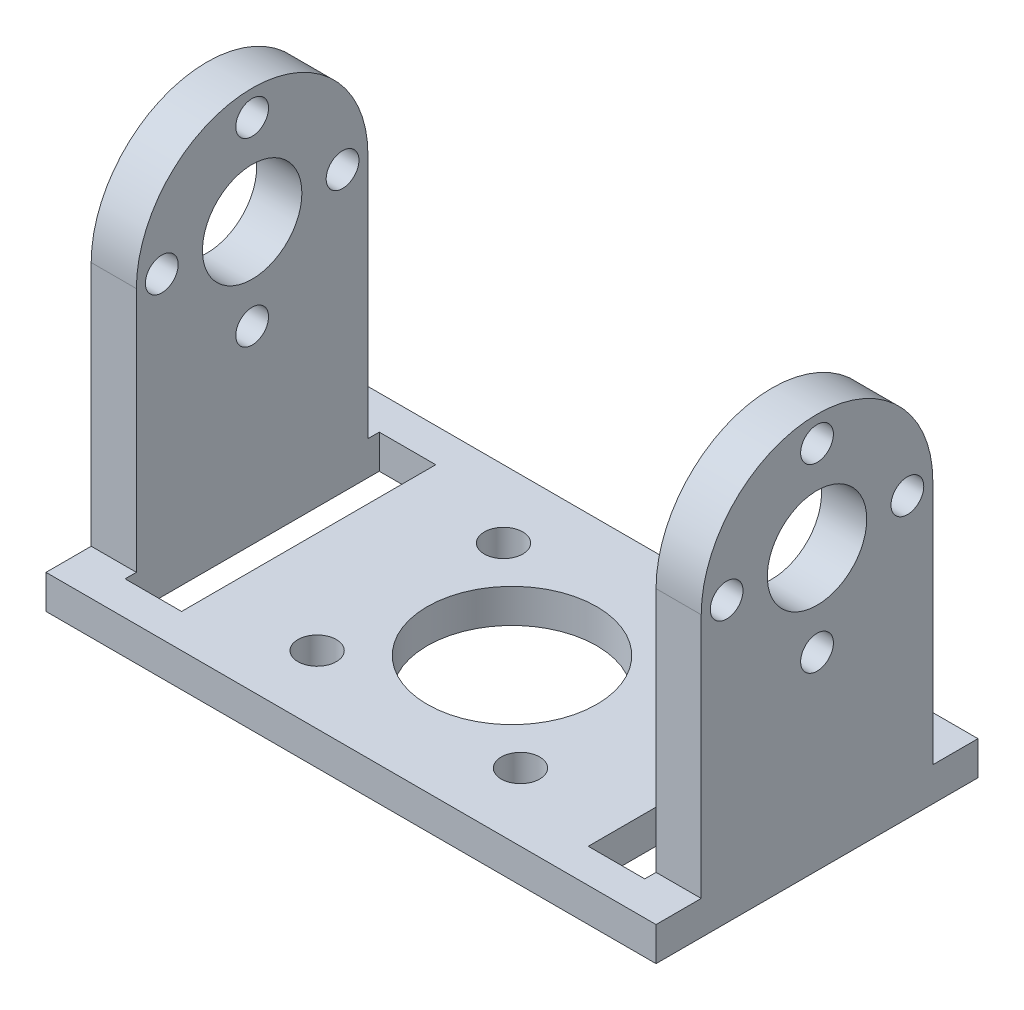
ISO-10303-21;
HEADER;
FILE_DESCRIPTION(('STEP AP214'),'2;1');
FILE_NAME('part.step','',(''),(''),'','','');
FILE_SCHEMA(('AUTOMOTIVE_DESIGN { 1 0 10303 214 1 1 1 1 }'));
ENDSEC;
DATA;
#1=APPLICATION_CONTEXT('core data for automotive mechanical design processes');
#2=APPLICATION_PROTOCOL_DEFINITION('international standard','automotive_design',2000,#1);
#3=PRODUCT_CONTEXT('',#1,'mechanical');
#4=PRODUCT('Part','Part','',(#3));
#5=PRODUCT_RELATED_PRODUCT_CATEGORY('part','',(#4));
#6=PRODUCT_DEFINITION_FORMATION('','',#4);
#7=PRODUCT_DEFINITION_CONTEXT('part definition',#1,'design');
#8=PRODUCT_DEFINITION('design','',#6,#7);
#9=PRODUCT_DEFINITION_SHAPE('','',#8);
#10=(LENGTH_UNIT() NAMED_UNIT(*) SI_UNIT(.MILLI.,.METRE.));
#11=(NAMED_UNIT(*) PLANE_ANGLE_UNIT() SI_UNIT($,.RADIAN.));
#12=(NAMED_UNIT(*) SI_UNIT($,.STERADIAN.) SOLID_ANGLE_UNIT());
#13=UNCERTAINTY_MEASURE_WITH_UNIT(LENGTH_MEASURE(1.E-05),#10,'distance_accuracy_value','');
#14=(GEOMETRIC_REPRESENTATION_CONTEXT(3) GLOBAL_UNCERTAINTY_ASSIGNED_CONTEXT((#13)) GLOBAL_UNIT_ASSIGNED_CONTEXT((#10,
#11,#12)) REPRESENTATION_CONTEXT('',''));
#15=CARTESIAN_POINT('',(0.,0.,0.));
#16=DIRECTION('',(0.,0.,1.));
#17=DIRECTION('',(1.,0.,0.));
#18=AXIS2_PLACEMENT_3D('',#15,#16,#17);
#19=CARTESIAN_POINT('',(27.,3.,0.));
#20=DIRECTION('',(1.,0.,0.));
#21=DIRECTION('',(0.,0.,-1.));
#22=AXIS2_PLACEMENT_3D('',#19,#20,#21);
#23=PLANE('',#22);
#24=CARTESIAN_POINT('',(27.,24.75,7.99999999999988));
#25=DIRECTION('',(1.,0.,0.));
#26=DIRECTION('',(0.,0.,-1.));
#27=AXIS2_PLACEMENT_3D('',#24,#25,#26);
#28=CIRCLE('',#27,1.45);
#29=CARTESIAN_POINT('',(27.,24.75,6.54999999999988));
#30=VERTEX_POINT('',#29);
#31=EDGE_CURVE('E896',#30,#30,#28,.T.);
#32=ORIENTED_EDGE('',*,*,#31,.F.);
#33=EDGE_LOOP('',(#32));
#34=FACE_BOUND('',#33,.T.);
#35=CARTESIAN_POINT('',(27.,16.7500000000001,-1.55942510366757E-13));
#36=DIRECTION('',(1.,0.,0.));
#37=DIRECTION('',(0.,0.,-1.));
#38=AXIS2_PLACEMENT_3D('',#35,#36,#37);
#39=CIRCLE('',#38,1.45);
#40=CARTESIAN_POINT('',(27.,16.7500000000001,-1.45000000000016));
#41=VERTEX_POINT('',#40);
#42=EDGE_CURVE('E883',#41,#41,#39,.T.);
#43=ORIENTED_EDGE('',*,*,#42,.F.);
#44=EDGE_LOOP('',(#43));
#45=FACE_BOUND('',#44,.T.);
#46=CARTESIAN_POINT('',(27.,24.7500000000001,-8.00000000000004));
#47=DIRECTION('',(1.,0.,0.));
#48=DIRECTION('',(0.,0.,-1.));
#49=AXIS2_PLACEMENT_3D('',#46,#47,#48);
#50=CIRCLE('',#49,1.45);
#51=CARTESIAN_POINT('',(27.,24.7500000000001,-9.45000000000005));
#52=VERTEX_POINT('',#51);
#53=EDGE_CURVE('E884',#52,#52,#50,.T.);
#54=ORIENTED_EDGE('',*,*,#53,.F.);
#55=EDGE_LOOP('',(#54));
#56=FACE_BOUND('',#55,.T.);
#57=CARTESIAN_POINT('',(27.,32.75,0.));
#58=DIRECTION('',(1.,0.,0.));
#59=DIRECTION('',(0.,0.,-1.));
#60=AXIS2_PLACEMENT_3D('',#57,#58,#59);
#61=CIRCLE('',#60,1.45);
#62=CARTESIAN_POINT('',(27.,32.75,-1.45000000000001));
#63=VERTEX_POINT('',#62);
#64=EDGE_CURVE('E877',#63,#63,#61,.T.);
#65=ORIENTED_EDGE('',*,*,#64,.F.);
#66=EDGE_LOOP('',(#65));
#67=FACE_BOUND('',#66,.T.);
#68=CARTESIAN_POINT('',(27.,24.75,0.));
#69=DIRECTION('',(1.,0.,0.));
#70=DIRECTION('',(0.,0.,-1.));
#71=AXIS2_PLACEMENT_3D('',#68,#69,#70);
#72=CIRCLE('',#71,4.4);
#73=CARTESIAN_POINT('',(27.,24.75,-4.40000000000001));
#74=VERTEX_POINT('',#73);
#75=EDGE_CURVE('E895',#74,#74,#72,.T.);
#76=ORIENTED_EDGE('',*,*,#75,.F.);
#77=EDGE_LOOP('',(#76));
#78=FACE_BOUND('',#77,.T.);
#79=DIRECTION('',(0.,-1.,0.));
#80=VECTOR('',#79,1.);
#81=CARTESIAN_POINT('',(27.,24.75,-10.25));
#82=LINE('',#81,#80);
#83=CARTESIAN_POINT('',(27.,24.75,-10.25));
#84=VERTEX_POINT('',#83);
#85=CARTESIAN_POINT('',(27.,3.,-10.25));
#86=VERTEX_POINT('',#85);
#87=EDGE_CURVE('E248',#84,#86,#82,.T.);
#88=ORIENTED_EDGE('',*,*,#87,.F.);
#89=CARTESIAN_POINT('',(27.,24.75,0.));
#90=DIRECTION('',(1.,0.,0.));
#91=DIRECTION('',(0.,0.,-1.));
#92=AXIS2_PLACEMENT_3D('',#89,#90,#91);
#93=CIRCLE('',#92,10.25);
#94=CARTESIAN_POINT('',(27.,24.75,10.25));
#95=VERTEX_POINT('',#94);
#96=EDGE_CURVE('E204',#84,#95,#93,.T.);
#97=ORIENTED_EDGE('',*,*,#96,.T.);
#98=DIRECTION('',(0.,-1.,0.));
#99=VECTOR('',#98,1.);
#100=CARTESIAN_POINT('',(27.,24.75,10.25));
#101=LINE('',#100,#99);
#102=CARTESIAN_POINT('',(27.,3.,10.25));
#103=VERTEX_POINT('',#102);
#104=EDGE_CURVE('E235',#95,#103,#101,.T.);
#105=ORIENTED_EDGE('',*,*,#104,.T.);
#106=DIRECTION('',(0.,0.,1.));
#107=VECTOR('',#106,1.);
#108=CARTESIAN_POINT('',(27.,3.,0.));
#109=LINE('',#108,#107);
#110=CARTESIAN_POINT('',(27.,3.,14.25));
#111=VERTEX_POINT('',#110);
#112=EDGE_CURVE('E274',#103,#111,#109,.T.);
#113=ORIENTED_EDGE('',*,*,#112,.T.);
#114=DIRECTION('',(0.,-1.,0.));
#115=VECTOR('',#114,1.);
#116=CARTESIAN_POINT('',(27.,3.,14.25));
#117=LINE('',#116,#115);
#118=CARTESIAN_POINT('',(27.,0.,14.25));
#119=VERTEX_POINT('',#118);
#120=EDGE_CURVE('E350',#111,#119,#117,.T.);
#121=ORIENTED_EDGE('',*,*,#120,.T.);
#122=DIRECTION('',(0.,0.,1.));
#123=VECTOR('',#122,1.);
#124=CARTESIAN_POINT('',(27.,0.,0.));
#125=LINE('',#124,#123);
#126=CARTESIAN_POINT('',(27.,0.,-14.25));
#127=VERTEX_POINT('',#126);
#128=EDGE_CURVE('E324',#127,#119,#125,.T.);
#129=ORIENTED_EDGE('',*,*,#128,.F.);
#130=DIRECTION('',(0.,-1.,0.));
#131=VECTOR('',#130,1.);
#132=CARTESIAN_POINT('',(27.,3.,-14.25));
#133=LINE('',#132,#131);
#134=CARTESIAN_POINT('',(27.,3.,-14.25));
#135=VERTEX_POINT('',#134);
#136=EDGE_CURVE('E11',#135,#127,#133,.T.);
#137=ORIENTED_EDGE('',*,*,#136,.F.);
#138=EDGE_CURVE('E275',#135,#86,#109,.T.);
#139=ORIENTED_EDGE('',*,*,#138,.T.);
#140=EDGE_LOOP('',(#88,#97,#105,#113,#121,#129,#137,#139));
#141=FACE_BOUND('',#140,.T.);
#142=ADVANCED_FACE('F45',(#34,#45,#56,#67,#78,#141),#23,.T.);
#143=CARTESIAN_POINT('',(0.,3.,-14.25));
#144=DIRECTION('',(0.,0.,1.));
#145=DIRECTION('',(1.,0.,0.));
#146=AXIS2_PLACEMENT_3D('',#143,#144,#145);
#147=PLANE('',#146);
#148=DIRECTION('',(-1.,0.,0.));
#149=VECTOR('',#148,1.);
#150=CARTESIAN_POINT('',(0.,0.,-14.25));
#151=LINE('',#150,#149);
#152=CARTESIAN_POINT('',(-27.,0.,-14.25));
#153=VERTEX_POINT('',#152);
#154=EDGE_CURVE('E327',#127,#153,#151,.T.);
#155=ORIENTED_EDGE('',*,*,#154,.T.);
#156=DIRECTION('',(0.,-1.,0.));
#157=VECTOR('',#156,1.);
#158=CARTESIAN_POINT('',(-27.,3.,-14.25));
#159=LINE('',#158,#157);
#160=CARTESIAN_POINT('',(-27.,3.,-14.25));
#161=VERTEX_POINT('',#160);
#162=EDGE_CURVE('E54',#161,#153,#159,.T.);
#163=ORIENTED_EDGE('',*,*,#162,.F.);
#164=DIRECTION('',(-1.,0.,0.));
#165=VECTOR('',#164,1.);
#166=CARTESIAN_POINT('',(0.,3.,-14.25));
#167=LINE('',#166,#165);
#168=EDGE_CURVE('E278',#135,#161,#167,.T.);
#169=ORIENTED_EDGE('',*,*,#168,.F.);
#170=ORIENTED_EDGE('',*,*,#136,.T.);
#171=EDGE_LOOP('',(#155,#163,#169,#170));
#172=FACE_BOUND('',#171,.T.);
#173=ADVANCED_FACE('F409',(#172),#147,.F.);
#174=CARTESIAN_POINT('',(-27.,3.,0.));
#175=DIRECTION('',(1.,0.,0.));
#176=DIRECTION('',(0.,0.,-1.));
#177=AXIS2_PLACEMENT_3D('',#174,#175,#176);
#178=PLANE('',#177);
#179=CARTESIAN_POINT('',(-27.,24.75,7.99999999999989));
#180=DIRECTION('',(1.,0.,0.));
#181=DIRECTION('',(0.,0.,-1.));
#182=AXIS2_PLACEMENT_3D('',#179,#180,#181);
#183=CIRCLE('',#182,1.45);
#184=CARTESIAN_POINT('',(-27.,24.75,6.54999999999989));
#185=VERTEX_POINT('',#184);
#186=EDGE_CURVE('E861',#185,#185,#183,.T.);
#187=ORIENTED_EDGE('',*,*,#186,.T.);
#188=EDGE_LOOP('',(#187));
#189=FACE_BOUND('',#188,.T.);
#190=CARTESIAN_POINT('',(-27.,16.7500000000001,-1.46081976924363E-13));
#191=DIRECTION('',(1.,0.,0.));
#192=DIRECTION('',(0.,0.,-1.));
#193=AXIS2_PLACEMENT_3D('',#190,#191,#192);
#194=CIRCLE('',#193,1.45);
#195=CARTESIAN_POINT('',(-27.,16.7500000000001,-1.45000000000015));
#196=VERTEX_POINT('',#195);
#197=EDGE_CURVE('E867',#196,#196,#194,.T.);
#198=ORIENTED_EDGE('',*,*,#197,.T.);
#199=EDGE_LOOP('',(#198));
#200=FACE_BOUND('',#199,.T.);
#201=CARTESIAN_POINT('',(-27.,24.7500000000001,-8.00000000000004));
#202=DIRECTION('',(1.,0.,0.));
#203=DIRECTION('',(0.,0.,-1.));
#204=AXIS2_PLACEMENT_3D('',#201,#202,#203);
#205=CIRCLE('',#204,1.45);
#206=CARTESIAN_POINT('',(-27.,24.7500000000001,-9.45000000000003));
#207=VERTEX_POINT('',#206);
#208=EDGE_CURVE('E936',#207,#207,#205,.T.);
#209=ORIENTED_EDGE('',*,*,#208,.T.);
#210=EDGE_LOOP('',(#209));
#211=FACE_BOUND('',#210,.T.);
#212=CARTESIAN_POINT('',(-27.,32.75,0.));
#213=DIRECTION('',(1.,0.,0.));
#214=DIRECTION('',(0.,0.,-1.));
#215=AXIS2_PLACEMENT_3D('',#212,#213,#214);
#216=CIRCLE('',#215,1.45);
#217=CARTESIAN_POINT('',(-27.,32.75,-1.45));
#218=VERTEX_POINT('',#217);
#219=EDGE_CURVE('E944',#218,#218,#216,.T.);
#220=ORIENTED_EDGE('',*,*,#219,.T.);
#221=EDGE_LOOP('',(#220));
#222=FACE_BOUND('',#221,.T.);
#223=CARTESIAN_POINT('',(-27.,24.75,0.));
#224=DIRECTION('',(1.,0.,0.));
#225=DIRECTION('',(0.,0.,-1.));
#226=AXIS2_PLACEMENT_3D('',#223,#224,#225);
#227=CIRCLE('',#226,4.4);
#228=CARTESIAN_POINT('',(-27.,24.75,-4.4));
#229=VERTEX_POINT('',#228);
#230=EDGE_CURVE('E864',#229,#229,#227,.T.);
#231=ORIENTED_EDGE('',*,*,#230,.T.);
#232=EDGE_LOOP('',(#231));
#233=FACE_BOUND('',#232,.T.);
#234=DIRECTION('',(0.,-1.,0.));
#235=VECTOR('',#234,1.);
#236=CARTESIAN_POINT('',(-27.,24.75,10.25));
#237=LINE('',#236,#235);
#238=CARTESIAN_POINT('',(-27.,24.75,10.25));
#239=VERTEX_POINT('',#238);
#240=CARTESIAN_POINT('',(-27.,3.,10.25));
#241=VERTEX_POINT('',#240);
#242=EDGE_CURVE('E198',#239,#241,#237,.T.);
#243=ORIENTED_EDGE('',*,*,#242,.F.);
#244=CARTESIAN_POINT('',(-27.,24.75,0.));
#245=DIRECTION('',(1.,0.,0.));
#246=DIRECTION('',(0.,0.,-1.));
#247=AXIS2_PLACEMENT_3D('',#244,#245,#246);
#248=CIRCLE('',#247,10.25);
#249=CARTESIAN_POINT('',(-27.,24.75,-10.25));
#250=VERTEX_POINT('',#249);
#251=EDGE_CURVE('E182',#250,#239,#248,.T.);
#252=ORIENTED_EDGE('',*,*,#251,.F.);
#253=DIRECTION('',(0.,-1.,0.));
#254=VECTOR('',#253,1.);
#255=CARTESIAN_POINT('',(-27.,24.75,-10.25));
#256=LINE('',#255,#254);
#257=CARTESIAN_POINT('',(-27.,3.,-10.25));
#258=VERTEX_POINT('',#257);
#259=EDGE_CURVE('E210',#250,#258,#256,.T.);
#260=ORIENTED_EDGE('',*,*,#259,.T.);
#261=DIRECTION('',(0.,0.,1.));
#262=VECTOR('',#261,1.);
#263=CARTESIAN_POINT('',(-27.,3.,0.));
#264=LINE('',#263,#262);
#265=EDGE_CURVE('E281',#161,#258,#264,.T.);
#266=ORIENTED_EDGE('',*,*,#265,.F.);
#267=ORIENTED_EDGE('',*,*,#162,.T.);
#268=DIRECTION('',(0.,0.,1.));
#269=VECTOR('',#268,1.);
#270=CARTESIAN_POINT('',(-27.,0.,0.));
#271=LINE('',#270,#269);
#272=CARTESIAN_POINT('',(-27.,0.,14.25));
#273=VERTEX_POINT('',#272);
#274=EDGE_CURVE('E330',#153,#273,#271,.T.);
#275=ORIENTED_EDGE('',*,*,#274,.T.);
#276=DIRECTION('',(0.,-1.,0.));
#277=VECTOR('',#276,1.);
#278=CARTESIAN_POINT('',(-27.,3.,14.25));
#279=LINE('',#278,#277);
#280=CARTESIAN_POINT('',(-27.,3.,14.25));
#281=VERTEX_POINT('',#280);
#282=EDGE_CURVE('E352',#281,#273,#279,.T.);
#283=ORIENTED_EDGE('',*,*,#282,.F.);
#284=EDGE_CURVE('E201',#241,#281,#264,.T.);
#285=ORIENTED_EDGE('',*,*,#284,.F.);
#286=EDGE_LOOP('',(#243,#252,#260,#266,#267,#275,#283,#285));
#287=FACE_BOUND('',#286,.T.);
#288=ADVANCED_FACE('F199',(#189,#200,#211,#222,#233,#287),#178,.F.);
#289=CARTESIAN_POINT('',(0.,3.,-11.25));
#290=DIRECTION('',(0.,0.,-1.));
#291=DIRECTION('',(-1.,0.,0.));
#292=AXIS2_PLACEMENT_3D('',#289,#290,#291);
#293=PLANE('',#292);
#294=DIRECTION('',(1.,0.,0.));
#295=VECTOR('',#294,1.);
#296=CARTESIAN_POINT('',(0.,0.,-11.25));
#297=LINE('',#296,#295);
#298=CARTESIAN_POINT('',(-23.,0.,-11.25));
#299=VERTEX_POINT('',#298);
#300=CARTESIAN_POINT('',(-18.,0.,-11.25));
#301=VERTEX_POINT('',#300);
#302=EDGE_CURVE('E312',#299,#301,#297,.T.);
#303=ORIENTED_EDGE('',*,*,#302,.T.);
#304=DIRECTION('',(0.,-1.,0.));
#305=VECTOR('',#304,1.);
#306=CARTESIAN_POINT('',(-18.,3.,-11.25));
#307=LINE('',#306,#305);
#308=CARTESIAN_POINT('',(-18.,3.,-11.25));
#309=VERTEX_POINT('',#308);
#310=EDGE_CURVE('E353',#309,#301,#307,.T.);
#311=ORIENTED_EDGE('',*,*,#310,.F.);
#312=DIRECTION('',(1.,0.,0.));
#313=VECTOR('',#312,1.);
#314=CARTESIAN_POINT('',(0.,3.,-11.25));
#315=LINE('',#314,#313);
#316=CARTESIAN_POINT('',(-23.,3.,-11.25));
#317=VERTEX_POINT('',#316);
#318=EDGE_CURVE('E264',#317,#309,#315,.T.);
#319=ORIENTED_EDGE('',*,*,#318,.F.);
#320=DIRECTION('',(0.,-1.,0.));
#321=VECTOR('',#320,1.);
#322=CARTESIAN_POINT('',(-23.,3.,-11.25));
#323=LINE('',#322,#321);
#324=EDGE_CURVE('E357',#317,#299,#323,.T.);
#325=ORIENTED_EDGE('',*,*,#324,.T.);
#326=EDGE_LOOP('',(#303,#311,#319,#325));
#327=FACE_BOUND('',#326,.T.);
#328=ADVANCED_FACE('F420',(#327),#293,.F.);
#329=CARTESIAN_POINT('',(-18.,3.,0.));
#330=DIRECTION('',(1.,0.,0.));
#331=DIRECTION('',(0.,0.,-1.));
#332=AXIS2_PLACEMENT_3D('',#329,#330,#331);
#333=PLANE('',#332);
#334=DIRECTION('',(0.,0.,1.));
#335=VECTOR('',#334,1.);
#336=CARTESIAN_POINT('',(-18.,0.,0.));
#337=LINE('',#336,#335);
#338=CARTESIAN_POINT('',(-18.,0.,11.25));
#339=VERTEX_POINT('',#338);
#340=EDGE_CURVE('E315',#301,#339,#337,.T.);
#341=ORIENTED_EDGE('',*,*,#340,.T.);
#342=DIRECTION('',(0.,-1.,0.));
#343=VECTOR('',#342,1.);
#344=CARTESIAN_POINT('',(-18.,3.,11.25));
#345=LINE('',#344,#343);
#346=CARTESIAN_POINT('',(-18.,3.,11.25));
#347=VERTEX_POINT('',#346);
#348=EDGE_CURVE('E361',#347,#339,#345,.T.);
#349=ORIENTED_EDGE('',*,*,#348,.F.);
#350=DIRECTION('',(0.,0.,1.));
#351=VECTOR('',#350,1.);
#352=CARTESIAN_POINT('',(-18.,3.,0.));
#353=LINE('',#352,#351);
#354=EDGE_CURVE('E267',#309,#347,#353,.T.);
#355=ORIENTED_EDGE('',*,*,#354,.F.);
#356=ORIENTED_EDGE('',*,*,#310,.T.);
#357=EDGE_LOOP('',(#341,#349,#355,#356));
#358=FACE_BOUND('',#357,.T.);
#359=ADVANCED_FACE('F423',(#358),#333,.F.);
#360=CARTESIAN_POINT('',(0.,3.,11.25));
#361=DIRECTION('',(0.,0.,-1.));
#362=DIRECTION('',(-1.,0.,0.));
#363=AXIS2_PLACEMENT_3D('',#360,#361,#362);
#364=PLANE('',#363);
#365=DIRECTION('',(1.,0.,0.));
#366=VECTOR('',#365,1.);
#367=CARTESIAN_POINT('',(0.,0.,11.25));
#368=LINE('',#367,#366);
#369=CARTESIAN_POINT('',(-23.,0.,11.25));
#370=VERTEX_POINT('',#369);
#371=EDGE_CURVE('E318',#370,#339,#368,.T.);
#372=ORIENTED_EDGE('',*,*,#371,.F.);
#373=DIRECTION('',(0.,-1.,0.));
#374=VECTOR('',#373,1.);
#375=CARTESIAN_POINT('',(-23.,3.,11.25));
#376=LINE('',#375,#374);
#377=CARTESIAN_POINT('',(-23.,3.,11.25));
#378=VERTEX_POINT('',#377);
#379=EDGE_CURVE('E359',#378,#370,#376,.T.);
#380=ORIENTED_EDGE('',*,*,#379,.F.);
#381=DIRECTION('',(1.,0.,0.));
#382=VECTOR('',#381,1.);
#383=CARTESIAN_POINT('',(0.,3.,11.25));
#384=LINE('',#383,#382);
#385=EDGE_CURVE('E269',#378,#347,#384,.T.);
#386=ORIENTED_EDGE('',*,*,#385,.T.);
#387=ORIENTED_EDGE('',*,*,#348,.T.);
#388=EDGE_LOOP('',(#372,#380,#386,#387));
#389=FACE_BOUND('',#388,.T.);
#390=ADVANCED_FACE('F427',(#389),#364,.T.);
#391=CARTESIAN_POINT('',(18.,3.,0.));
#392=DIRECTION('',(1.,0.,0.));
#393=DIRECTION('',(0.,0.,-1.));
#394=AXIS2_PLACEMENT_3D('',#391,#392,#393);
#395=PLANE('',#394);
#396=DIRECTION('',(0.,0.,1.));
#397=VECTOR('',#396,1.);
#398=CARTESIAN_POINT('',(18.,0.,0.));
#399=LINE('',#398,#397);
#400=CARTESIAN_POINT('',(18.,0.,-11.25));
#401=VERTEX_POINT('',#400);
#402=CARTESIAN_POINT('',(18.,0.,11.25));
#403=VERTEX_POINT('',#402);
#404=EDGE_CURVE('E251',#401,#403,#399,.T.);
#405=ORIENTED_EDGE('',*,*,#404,.F.);
#406=DIRECTION('',(0.,-1.,0.));
#407=VECTOR('',#406,1.);
#408=CARTESIAN_POINT('',(18.,3.,-11.25));
#409=LINE('',#408,#407);
#410=CARTESIAN_POINT('',(18.,3.,-11.25));
#411=VERTEX_POINT('',#410);
#412=EDGE_CURVE('E49',#411,#401,#409,.T.);
#413=ORIENTED_EDGE('',*,*,#412,.F.);
#414=DIRECTION('',(0.,0.,1.));
#415=VECTOR('',#414,1.);
#416=CARTESIAN_POINT('',(18.,3.,0.));
#417=LINE('',#416,#415);
#418=CARTESIAN_POINT('',(18.,3.,11.25));
#419=VERTEX_POINT('',#418);
#420=EDGE_CURVE('E252',#411,#419,#417,.T.);
#421=ORIENTED_EDGE('',*,*,#420,.T.);
#422=DIRECTION('',(0.,-1.,0.));
#423=VECTOR('',#422,1.);
#424=CARTESIAN_POINT('',(18.,3.,11.25));
#425=LINE('',#424,#423);
#426=EDGE_CURVE('E301',#419,#403,#425,.T.);
#427=ORIENTED_EDGE('',*,*,#426,.T.);
#428=EDGE_LOOP('',(#405,#413,#421,#427));
#429=FACE_BOUND('',#428,.T.);
#430=ADVANCED_FACE('F47',(#429),#395,.T.);
#431=CARTESIAN_POINT('',(0.,3.,-11.25));
#432=DIRECTION('',(0.,0.,1.));
#433=DIRECTION('',(1.,0.,0.));
#434=AXIS2_PLACEMENT_3D('',#431,#432,#433);
#435=PLANE('',#434);
#436=DIRECTION('',(-1.,0.,0.));
#437=VECTOR('',#436,1.);
#438=CARTESIAN_POINT('',(0.,0.,-11.25));
#439=LINE('',#438,#437);
#440=CARTESIAN_POINT('',(23.,0.,-11.25));
#441=VERTEX_POINT('',#440);
#442=EDGE_CURVE('E304',#441,#401,#439,.T.);
#443=ORIENTED_EDGE('',*,*,#442,.F.);
#444=DIRECTION('',(0.,-1.,0.));
#445=VECTOR('',#444,1.);
#446=CARTESIAN_POINT('',(23.,3.,-11.25));
#447=LINE('',#446,#445);
#448=CARTESIAN_POINT('',(23.,3.,-11.25));
#449=VERTEX_POINT('',#448);
#450=EDGE_CURVE('E368',#449,#441,#447,.T.);
#451=ORIENTED_EDGE('',*,*,#450,.F.);
#452=DIRECTION('',(-1.,0.,0.));
#453=VECTOR('',#452,1.);
#454=CARTESIAN_POINT('',(0.,3.,-11.25));
#455=LINE('',#454,#453);
#456=EDGE_CURVE('E255',#449,#411,#455,.T.);
#457=ORIENTED_EDGE('',*,*,#456,.T.);
#458=ORIENTED_EDGE('',*,*,#412,.T.);
#459=EDGE_LOOP('',(#443,#451,#457,#458));
#460=FACE_BOUND('',#459,.T.);
#461=ADVANCED_FACE('F375',(#460),#435,.T.);
#462=CARTESIAN_POINT('',(23.,3.,0.));
#463=DIRECTION('',(1.,0.,0.));
#464=DIRECTION('',(0.,0.,-1.));
#465=AXIS2_PLACEMENT_3D('',#462,#463,#464);
#466=PLANE('',#465);
#467=CARTESIAN_POINT('',(23.,24.75,7.99999999999988));
#468=DIRECTION('',(1.,0.,0.));
#469=DIRECTION('',(0.,0.,-1.));
#470=AXIS2_PLACEMENT_3D('',#467,#468,#469);
#471=CIRCLE('',#470,1.45);
#472=CARTESIAN_POINT('',(23.,24.75,6.54999999999988));
#473=VERTEX_POINT('',#472);
#474=EDGE_CURVE('E892',#473,#473,#471,.T.);
#475=ORIENTED_EDGE('',*,*,#474,.T.);
#476=EDGE_LOOP('',(#475));
#477=FACE_BOUND('',#476,.T.);
#478=CARTESIAN_POINT('',(23.,16.7500000000001,-1.55455570443676E-13));
#479=DIRECTION('',(1.,0.,0.));
#480=DIRECTION('',(0.,0.,-1.));
#481=AXIS2_PLACEMENT_3D('',#478,#479,#480);
#482=CIRCLE('',#481,1.45);
#483=CARTESIAN_POINT('',(23.,16.7500000000001,-1.45000000000016));
#484=VERTEX_POINT('',#483);
#485=EDGE_CURVE('E899',#484,#484,#482,.T.);
#486=ORIENTED_EDGE('',*,*,#485,.T.);
#487=EDGE_LOOP('',(#486));
#488=FACE_BOUND('',#487,.T.);
#489=CARTESIAN_POINT('',(23.,24.7500000000001,-8.00000000000004));
#490=DIRECTION('',(1.,0.,0.));
#491=DIRECTION('',(0.,0.,-1.));
#492=AXIS2_PLACEMENT_3D('',#489,#490,#491);
#493=CIRCLE('',#492,1.45);
#494=CARTESIAN_POINT('',(23.,24.7500000000001,-9.45000000000005));
#495=VERTEX_POINT('',#494);
#496=EDGE_CURVE('E880',#495,#495,#493,.T.);
#497=ORIENTED_EDGE('',*,*,#496,.T.);
#498=EDGE_LOOP('',(#497));
#499=FACE_BOUND('',#498,.T.);
#500=CARTESIAN_POINT('',(23.,32.75,0.));
#501=DIRECTION('',(1.,0.,0.));
#502=DIRECTION('',(0.,0.,-1.));
#503=AXIS2_PLACEMENT_3D('',#500,#501,#502);
#504=CIRCLE('',#503,1.45);
#505=CARTESIAN_POINT('',(23.,32.75,-1.45000000000001));
#506=VERTEX_POINT('',#505);
#507=EDGE_CURVE('E887',#506,#506,#504,.T.);
#508=ORIENTED_EDGE('',*,*,#507,.T.);
#509=EDGE_LOOP('',(#508));
#510=FACE_BOUND('',#509,.T.);
#511=CARTESIAN_POINT('',(23.,24.75,0.));
#512=DIRECTION('',(1.,0.,0.));
#513=DIRECTION('',(0.,0.,-1.));
#514=AXIS2_PLACEMENT_3D('',#511,#512,#513);
#515=CIRCLE('',#514,4.4);
#516=CARTESIAN_POINT('',(23.,24.75,-4.40000000000001));
#517=VERTEX_POINT('',#516);
#518=EDGE_CURVE('E194',#517,#517,#515,.T.);
#519=ORIENTED_EDGE('',*,*,#518,.T.);
#520=EDGE_LOOP('',(#519));
#521=FACE_BOUND('',#520,.T.);
#522=DIRECTION('',(0.,-1.,0.));
#523=VECTOR('',#522,1.);
#524=CARTESIAN_POINT('',(23.,24.75,10.25));
#525=LINE('',#524,#523);
#526=CARTESIAN_POINT('',(23.,24.75,10.25));
#527=VERTEX_POINT('',#526);
#528=CARTESIAN_POINT('',(23.,3.,10.25));
#529=VERTEX_POINT('',#528);
#530=EDGE_CURVE('E242',#527,#529,#525,.T.);
#531=ORIENTED_EDGE('',*,*,#530,.F.);
#532=CARTESIAN_POINT('',(23.,24.75,0.));
#533=DIRECTION('',(1.,0.,0.));
#534=DIRECTION('',(0.,0.,-1.));
#535=AXIS2_PLACEMENT_3D('',#532,#533,#534);
#536=CIRCLE('',#535,10.25);
#537=CARTESIAN_POINT('',(23.,24.75,-10.25));
#538=VERTEX_POINT('',#537);
#539=EDGE_CURVE('E222',#538,#527,#536,.T.);
#540=ORIENTED_EDGE('',*,*,#539,.F.);
#541=DIRECTION('',(0.,-1.,0.));
#542=VECTOR('',#541,1.);
#543=CARTESIAN_POINT('',(23.,24.75,-10.25));
#544=LINE('',#543,#542);
#545=CARTESIAN_POINT('',(23.,3.,-10.25));
#546=VERTEX_POINT('',#545);
#547=EDGE_CURVE('E245',#538,#546,#544,.T.);
#548=ORIENTED_EDGE('',*,*,#547,.T.);
#549=DIRECTION('',(0.,0.,1.));
#550=VECTOR('',#549,1.);
#551=CARTESIAN_POINT('',(23.,3.,0.));
#552=LINE('',#551,#550);
#553=EDGE_CURVE('E260',#449,#546,#552,.T.);
#554=ORIENTED_EDGE('',*,*,#553,.F.);
#555=ORIENTED_EDGE('',*,*,#450,.T.);
#556=DIRECTION('',(0.,0.,1.));
#557=VECTOR('',#556,1.);
#558=CARTESIAN_POINT('',(23.,0.,0.));
#559=LINE('',#558,#557);
#560=CARTESIAN_POINT('',(23.,0.,11.25));
#561=VERTEX_POINT('',#560);
#562=EDGE_CURVE('E307',#441,#561,#559,.T.);
#563=ORIENTED_EDGE('',*,*,#562,.T.);
#564=DIRECTION('',(0.,-1.,0.));
#565=VECTOR('',#564,1.);
#566=CARTESIAN_POINT('',(23.,3.,11.25));
#567=LINE('',#566,#565);
#568=CARTESIAN_POINT('',(23.,3.,11.25));
#569=VERTEX_POINT('',#568);
#570=EDGE_CURVE('E366',#569,#561,#567,.T.);
#571=ORIENTED_EDGE('',*,*,#570,.F.);
#572=EDGE_CURVE('E259',#529,#569,#552,.T.);
#573=ORIENTED_EDGE('',*,*,#572,.F.);
#574=EDGE_LOOP('',(#531,#540,#548,#554,#555,#563,#571,#573));
#575=FACE_BOUND('',#574,.T.);
#576=ADVANCED_FACE('F385',(#477,#488,#499,#510,#521,#575),#466,.F.);
#577=CARTESIAN_POINT('',(0.,3.,0.));
#578=DIRECTION('',(0.,-1.,0.));
#579=DIRECTION('',(0.,0.,-1.));
#580=AXIS2_PLACEMENT_3D('',#577,#578,#579);
#581=CYLINDRICAL_SURFACE('',#580,7.5);
#582=CARTESIAN_POINT('',(0.,3.,0.));
#583=DIRECTION('',(0.,1.,0.));
#584=DIRECTION('',(0.,0.,1.));
#585=AXIS2_PLACEMENT_3D('',#582,#583,#584);
#586=CIRCLE('',#585,7.5);
#587=CARTESIAN_POINT('',(0.,3.,7.49999999999999));
#588=VERTEX_POINT('',#587);
#589=EDGE_CURVE('E295',#588,#588,#586,.T.);
#590=ORIENTED_EDGE('',*,*,#589,.T.);
#591=EDGE_LOOP('',(#590));
#592=FACE_BOUND('',#591,.T.);
#593=CARTESIAN_POINT('',(0.,0.,0.));
#594=DIRECTION('',(0.,1.,0.));
#595=DIRECTION('',(0.,0.,1.));
#596=AXIS2_PLACEMENT_3D('',#593,#594,#595);
#597=CIRCLE('',#596,7.5);
#598=CARTESIAN_POINT('',(0.,0.,7.49999999999999));
#599=VERTEX_POINT('',#598);
#600=EDGE_CURVE('E345',#599,#599,#597,.T.);
#601=ORIENTED_EDGE('',*,*,#600,.F.);
#602=EDGE_LOOP('',(#601));
#603=FACE_BOUND('',#602,.T.);
#604=ADVANCED_FACE('F481',(#592,#603),#581,.F.);
#605=CARTESIAN_POINT('',(-9.,3.,-8.25000000000001));
#606=DIRECTION('',(0.,-1.,0.));
#607=DIRECTION('',(0.,0.,-1.));
#608=AXIS2_PLACEMENT_3D('',#605,#606,#607);
#609=CYLINDRICAL_SURFACE('',#608,1.7);
#610=CARTESIAN_POINT('',(-9.,3.,-8.25000000000001));
#611=DIRECTION('',(0.,1.,0.));
#612=DIRECTION('',(0.,0.,1.));
#613=AXIS2_PLACEMENT_3D('',#610,#611,#612);
#614=CIRCLE('',#613,1.7);
#615=CARTESIAN_POINT('',(-9.,3.,-6.55000000000001));
#616=VERTEX_POINT('',#615);
#617=EDGE_CURVE('E292',#616,#616,#614,.T.);
#618=ORIENTED_EDGE('',*,*,#617,.T.);
#619=EDGE_LOOP('',(#618));
#620=FACE_BOUND('',#619,.T.);
#621=CARTESIAN_POINT('',(-9.,0.,-8.25000000000001));
#622=DIRECTION('',(0.,1.,0.));
#623=DIRECTION('',(0.,0.,1.));
#624=AXIS2_PLACEMENT_3D('',#621,#622,#623);
#625=CIRCLE('',#624,1.7);
#626=CARTESIAN_POINT('',(-9.,0.,-6.55000000000001));
#627=VERTEX_POINT('',#626);
#628=EDGE_CURVE('E342',#627,#627,#625,.T.);
#629=ORIENTED_EDGE('',*,*,#628,.F.);
#630=EDGE_LOOP('',(#629));
#631=FACE_BOUND('',#630,.T.);
#632=ADVANCED_FACE('F765',(#620,#631),#609,.F.);
#633=CARTESIAN_POINT('',(-9.,3.,8.24999999999999));
#634=DIRECTION('',(0.,-1.,0.));
#635=DIRECTION('',(0.,0.,-1.));
#636=AXIS2_PLACEMENT_3D('',#633,#634,#635);
#637=CYLINDRICAL_SURFACE('',#636,1.7);
#638=CARTESIAN_POINT('',(-9.,3.,8.24999999999999));
#639=DIRECTION('',(0.,1.,0.));
#640=DIRECTION('',(0.,0.,1.));
#641=AXIS2_PLACEMENT_3D('',#638,#639,#640);
#642=CIRCLE('',#641,1.7);
#643=CARTESIAN_POINT('',(-9.,3.,9.94999999999999));
#644=VERTEX_POINT('',#643);
#645=EDGE_CURVE('E289',#644,#644,#642,.T.);
#646=ORIENTED_EDGE('',*,*,#645,.T.);
#647=EDGE_LOOP('',(#646));
#648=FACE_BOUND('',#647,.T.);
#649=CARTESIAN_POINT('',(-9.,0.,8.24999999999999));
#650=DIRECTION('',(0.,1.,0.));
#651=DIRECTION('',(0.,0.,1.));
#652=AXIS2_PLACEMENT_3D('',#649,#650,#651);
#653=CIRCLE('',#652,1.7);
#654=CARTESIAN_POINT('',(-9.,0.,9.94999999999999));
#655=VERTEX_POINT('',#654);
#656=EDGE_CURVE('E339',#655,#655,#653,.T.);
#657=ORIENTED_EDGE('',*,*,#656,.F.);
#658=EDGE_LOOP('',(#657));
#659=FACE_BOUND('',#658,.T.);
#660=ADVANCED_FACE('F774',(#648,#659),#637,.F.);
#661=CARTESIAN_POINT('',(9.,3.,8.24999999999999));
#662=DIRECTION('',(0.,-1.,0.));
#663=DIRECTION('',(0.,0.,-1.));
#664=AXIS2_PLACEMENT_3D('',#661,#662,#663);
#665=CYLINDRICAL_SURFACE('',#664,1.7);
#666=CARTESIAN_POINT('',(9.,3.,8.24999999999999));
#667=DIRECTION('',(0.,1.,0.));
#668=DIRECTION('',(0.,0.,1.));
#669=AXIS2_PLACEMENT_3D('',#666,#667,#668);
#670=CIRCLE('',#669,1.7);
#671=CARTESIAN_POINT('',(9.,3.,9.94999999999999));
#672=VERTEX_POINT('',#671);
#673=EDGE_CURVE('E286',#672,#672,#670,.F.);
#674=ORIENTED_EDGE('',*,*,#673,.F.);
#675=EDGE_LOOP('',(#674));
#676=FACE_BOUND('',#675,.T.);
#677=CARTESIAN_POINT('',(9.,0.,8.24999999999999));
#678=DIRECTION('',(0.,1.,0.));
#679=DIRECTION('',(0.,0.,1.));
#680=AXIS2_PLACEMENT_3D('',#677,#678,#679);
#681=CIRCLE('',#680,1.7);
#682=CARTESIAN_POINT('',(9.,0.,9.94999999999999));
#683=VERTEX_POINT('',#682);
#684=EDGE_CURVE('E336',#683,#683,#681,.F.);
#685=ORIENTED_EDGE('',*,*,#684,.T.);
#686=EDGE_LOOP('',(#685));
#687=FACE_BOUND('',#686,.T.);
#688=ADVANCED_FACE('F784',(#676,#687),#665,.F.);
#689=CARTESIAN_POINT('',(0.,3.,14.25));
#690=DIRECTION('',(0.,0.,1.));
#691=DIRECTION('',(1.,0.,0.));
#692=AXIS2_PLACEMENT_3D('',#689,#690,#691);
#693=PLANE('',#692);
#694=DIRECTION('',(-1.,0.,0.));
#695=VECTOR('',#694,1.);
#696=CARTESIAN_POINT('',(0.,0.,14.25));
#697=LINE('',#696,#695);
#698=EDGE_CURVE('E333',#119,#273,#697,.T.);
#699=ORIENTED_EDGE('',*,*,#698,.F.);
#700=ORIENTED_EDGE('',*,*,#120,.F.);
#701=DIRECTION('',(-1.,0.,0.));
#702=VECTOR('',#701,1.);
#703=CARTESIAN_POINT('',(0.,3.,14.25));
#704=LINE('',#703,#702);
#705=EDGE_CURVE('E283',#111,#281,#704,.T.);
#706=ORIENTED_EDGE('',*,*,#705,.T.);
#707=ORIENTED_EDGE('',*,*,#282,.T.);
#708=EDGE_LOOP('',(#699,#700,#706,#707));
#709=FACE_BOUND('',#708,.T.);
#710=ADVANCED_FACE('F432',(#709),#693,.T.);
#711=CARTESIAN_POINT('',(-23.,3.,0.));
#712=DIRECTION('',(1.,0.,0.));
#713=DIRECTION('',(0.,0.,-1.));
#714=AXIS2_PLACEMENT_3D('',#711,#712,#713);
#715=PLANE('',#714);
#716=CARTESIAN_POINT('',(-23.,24.75,7.99999999999989));
#717=DIRECTION('',(1.,0.,0.));
#718=DIRECTION('',(0.,0.,-1.));
#719=AXIS2_PLACEMENT_3D('',#716,#717,#718);
#720=CIRCLE('',#719,1.45);
#721=CARTESIAN_POINT('',(-23.,24.75,6.54999999999989));
#722=VERTEX_POINT('',#721);
#723=EDGE_CURVE('E858',#722,#722,#720,.T.);
#724=ORIENTED_EDGE('',*,*,#723,.F.);
#725=EDGE_LOOP('',(#724));
#726=FACE_BOUND('',#725,.T.);
#727=CARTESIAN_POINT('',(-23.,16.7500000000001,-1.47055856770525E-13));
#728=DIRECTION('',(1.,0.,0.));
#729=DIRECTION('',(0.,0.,-1.));
#730=AXIS2_PLACEMENT_3D('',#727,#728,#729);
#731=CIRCLE('',#730,1.45);
#732=CARTESIAN_POINT('',(-23.,16.7500000000001,-1.45000000000015));
#733=VERTEX_POINT('',#732);
#734=EDGE_CURVE('E862',#733,#733,#731,.T.);
#735=ORIENTED_EDGE('',*,*,#734,.F.);
#736=EDGE_LOOP('',(#735));
#737=FACE_BOUND('',#736,.T.);
#738=CARTESIAN_POINT('',(-23.,24.7500000000001,-8.00000000000004));
#739=DIRECTION('',(1.,0.,0.));
#740=DIRECTION('',(0.,0.,-1.));
#741=AXIS2_PLACEMENT_3D('',#738,#739,#740);
#742=CIRCLE('',#741,1.45);
#743=CARTESIAN_POINT('',(-23.,24.7500000000001,-9.45000000000004));
#744=VERTEX_POINT('',#743);
#745=EDGE_CURVE('E873',#744,#744,#742,.T.);
#746=ORIENTED_EDGE('',*,*,#745,.F.);
#747=EDGE_LOOP('',(#746));
#748=FACE_BOUND('',#747,.T.);
#749=CARTESIAN_POINT('',(-23.,32.75,0.));
#750=DIRECTION('',(1.,0.,0.));
#751=DIRECTION('',(0.,0.,-1.));
#752=AXIS2_PLACEMENT_3D('',#749,#750,#751);
#753=CIRCLE('',#752,1.45);
#754=CARTESIAN_POINT('',(-23.,32.75,-1.45));
#755=VERTEX_POINT('',#754);
#756=EDGE_CURVE('E940',#755,#755,#753,.T.);
#757=ORIENTED_EDGE('',*,*,#756,.F.);
#758=EDGE_LOOP('',(#757));
#759=FACE_BOUND('',#758,.T.);
#760=CARTESIAN_POINT('',(-23.,24.75,0.));
#761=DIRECTION('',(1.,0.,0.));
#762=DIRECTION('',(0.,0.,-1.));
#763=AXIS2_PLACEMENT_3D('',#760,#761,#762);
#764=CIRCLE('',#763,4.4);
#765=CARTESIAN_POINT('',(-23.,24.75,-4.4));
#766=VERTEX_POINT('',#765);
#767=EDGE_CURVE('E874',#766,#766,#764,.T.);
#768=ORIENTED_EDGE('',*,*,#767,.F.);
#769=EDGE_LOOP('',(#768));
#770=FACE_BOUND('',#769,.T.);
#771=DIRECTION('',(0.,-1.,0.));
#772=VECTOR('',#771,1.);
#773=CARTESIAN_POINT('',(-23.,24.75,-10.25));
#774=LINE('',#773,#772);
#775=CARTESIAN_POINT('',(-23.,24.75,-10.25));
#776=VERTEX_POINT('',#775);
#777=CARTESIAN_POINT('',(-23.,3.,-10.25));
#778=VERTEX_POINT('',#777);
#779=EDGE_CURVE('E218',#776,#778,#774,.T.);
#780=ORIENTED_EDGE('',*,*,#779,.F.);
#781=CARTESIAN_POINT('',(-23.,24.75,0.));
#782=DIRECTION('',(1.,0.,0.));
#783=DIRECTION('',(0.,0.,-1.));
#784=AXIS2_PLACEMENT_3D('',#781,#782,#783);
#785=CIRCLE('',#784,10.25);
#786=CARTESIAN_POINT('',(-23.,24.75,10.25));
#787=VERTEX_POINT('',#786);
#788=EDGE_CURVE('E193',#776,#787,#785,.T.);
#789=ORIENTED_EDGE('',*,*,#788,.T.);
#790=DIRECTION('',(0.,-1.,0.));
#791=VECTOR('',#790,1.);
#792=CARTESIAN_POINT('',(-23.,24.75,10.25));
#793=LINE('',#792,#791);
#794=CARTESIAN_POINT('',(-23.,3.,10.25));
#795=VERTEX_POINT('',#794);
#796=EDGE_CURVE('E205',#787,#795,#793,.T.);
#797=ORIENTED_EDGE('',*,*,#796,.T.);
#798=DIRECTION('',(0.,0.,1.));
#799=VECTOR('',#798,1.);
#800=CARTESIAN_POINT('',(-23.,3.,0.));
#801=LINE('',#800,#799);
#802=EDGE_CURVE('E62',#795,#378,#801,.T.);
#803=ORIENTED_EDGE('',*,*,#802,.T.);
#804=ORIENTED_EDGE('',*,*,#379,.T.);
#805=DIRECTION('',(0.,0.,1.));
#806=VECTOR('',#805,1.);
#807=CARTESIAN_POINT('',(-23.,0.,0.));
#808=LINE('',#807,#806);
#809=EDGE_CURVE('E321',#299,#370,#808,.T.);
#810=ORIENTED_EDGE('',*,*,#809,.F.);
#811=ORIENTED_EDGE('',*,*,#324,.F.);
#812=EDGE_CURVE('E272',#317,#778,#801,.T.);
#813=ORIENTED_EDGE('',*,*,#812,.T.);
#814=EDGE_LOOP('',(#780,#789,#797,#803,#804,#810,#811,#813));
#815=FACE_BOUND('',#814,.T.);
#816=ADVANCED_FACE('F414',(#726,#737,#748,#759,#770,#815),#715,.T.);
#817=CARTESIAN_POINT('',(0.,3.,11.25));
#818=DIRECTION('',(0.,0.,1.));
#819=DIRECTION('',(1.,0.,0.));
#820=AXIS2_PLACEMENT_3D('',#817,#818,#819);
#821=PLANE('',#820);
#822=DIRECTION('',(-1.,0.,0.));
#823=VECTOR('',#822,1.);
#824=CARTESIAN_POINT('',(0.,0.,11.25));
#825=LINE('',#824,#823);
#826=EDGE_CURVE('E309',#561,#403,#825,.T.);
#827=ORIENTED_EDGE('',*,*,#826,.T.);
#828=ORIENTED_EDGE('',*,*,#426,.F.);
#829=DIRECTION('',(-1.,0.,0.));
#830=VECTOR('',#829,1.);
#831=CARTESIAN_POINT('',(0.,3.,11.25));
#832=LINE('',#831,#830);
#833=EDGE_CURVE('E262',#569,#419,#832,.T.);
#834=ORIENTED_EDGE('',*,*,#833,.F.);
#835=ORIENTED_EDGE('',*,*,#570,.T.);
#836=EDGE_LOOP('',(#827,#828,#834,#835));
#837=FACE_BOUND('',#836,.T.);
#838=ADVANCED_FACE('F389',(#837),#821,.F.);
#839=CARTESIAN_POINT('',(9.,3.,-8.25000000000001));
#840=DIRECTION('',(0.,-1.,0.));
#841=DIRECTION('',(0.,0.,-1.));
#842=AXIS2_PLACEMENT_3D('',#839,#840,#841);
#843=CYLINDRICAL_SURFACE('',#842,1.7);
#844=CARTESIAN_POINT('',(9.,3.,-8.25000000000001));
#845=DIRECTION('',(0.,1.,0.));
#846=DIRECTION('',(0.,0.,1.));
#847=AXIS2_PLACEMENT_3D('',#844,#845,#846);
#848=CIRCLE('',#847,1.7);
#849=CARTESIAN_POINT('',(9.,3.,-6.55000000000001));
#850=VERTEX_POINT('',#849);
#851=EDGE_CURVE('E298',#850,#850,#848,.F.);
#852=ORIENTED_EDGE('',*,*,#851,.F.);
#853=EDGE_LOOP('',(#852));
#854=FACE_BOUND('',#853,.T.);
#855=CARTESIAN_POINT('',(9.,0.,-8.25000000000001));
#856=DIRECTION('',(0.,1.,0.));
#857=DIRECTION('',(0.,0.,1.));
#858=AXIS2_PLACEMENT_3D('',#855,#856,#857);
#859=CIRCLE('',#858,1.7);
#860=CARTESIAN_POINT('',(9.,0.,-6.55000000000001));
#861=VERTEX_POINT('',#860);
#862=EDGE_CURVE('E256',#861,#861,#859,.F.);
#863=ORIENTED_EDGE('',*,*,#862,.T.);
#864=EDGE_LOOP('',(#863));
#865=FACE_BOUND('',#864,.T.);
#866=ADVANCED_FACE('F447',(#854,#865),#843,.F.);
#867=CARTESIAN_POINT('',(0.,3.,0.));
#868=DIRECTION('',(0.,1.,0.));
#869=DIRECTION('',(0.,0.,1.));
#870=AXIS2_PLACEMENT_3D('',#867,#868,#869);
#871=PLANE('',#870);
#872=DIRECTION('',(-1.,0.,0.));
#873=VECTOR('',#872,1.);
#874=CARTESIAN_POINT('',(-27.,3.,10.25));
#875=LINE('',#874,#873);
#876=EDGE_CURVE('E212',#795,#241,#875,.T.);
#877=ORIENTED_EDGE('',*,*,#876,.T.);
#878=ORIENTED_EDGE('',*,*,#284,.T.);
#879=ORIENTED_EDGE('',*,*,#705,.F.);
#880=ORIENTED_EDGE('',*,*,#112,.F.);
#881=DIRECTION('',(1.,0.,0.));
#882=VECTOR('',#881,1.);
#883=CARTESIAN_POINT('',(27.,3.,10.25));
#884=LINE('',#883,#882);
#885=EDGE_CURVE('E232',#529,#103,#884,.T.);
#886=ORIENTED_EDGE('',*,*,#885,.F.);
#887=ORIENTED_EDGE('',*,*,#572,.T.);
#888=ORIENTED_EDGE('',*,*,#833,.T.);
#889=ORIENTED_EDGE('',*,*,#420,.F.);
#890=ORIENTED_EDGE('',*,*,#456,.F.);
#891=ORIENTED_EDGE('',*,*,#553,.T.);
#892=DIRECTION('',(-1.,0.,0.));
#893=VECTOR('',#892,1.);
#894=CARTESIAN_POINT('',(27.,3.,-10.25));
#895=LINE('',#894,#893);
#896=EDGE_CURVE('E225',#86,#546,#895,.T.);
#897=ORIENTED_EDGE('',*,*,#896,.F.);
#898=ORIENTED_EDGE('',*,*,#138,.F.);
#899=ORIENTED_EDGE('',*,*,#168,.T.);
#900=ORIENTED_EDGE('',*,*,#265,.T.);
#901=DIRECTION('',(1.,0.,0.));
#902=VECTOR('',#901,1.);
#903=CARTESIAN_POINT('',(-27.,3.,-10.25));
#904=LINE('',#903,#902);
#905=EDGE_CURVE('E69',#258,#778,#904,.T.);
#906=ORIENTED_EDGE('',*,*,#905,.T.);
#907=ORIENTED_EDGE('',*,*,#812,.F.);
#908=ORIENTED_EDGE('',*,*,#318,.T.);
#909=ORIENTED_EDGE('',*,*,#354,.T.);
#910=ORIENTED_EDGE('',*,*,#385,.F.);
#911=ORIENTED_EDGE('',*,*,#802,.F.);
#912=EDGE_LOOP('',(#877,#878,#879,#880,#886,#887,#888,#889,#890,#891,#897,#898,#899,#900,#906,
#907,#908,#909,#910,#911));
#913=FACE_BOUND('',#912,.T.);
#914=ORIENTED_EDGE('',*,*,#673,.T.);
#915=EDGE_LOOP('',(#914));
#916=FACE_BOUND('',#915,.T.);
#917=ORIENTED_EDGE('',*,*,#645,.F.);
#918=EDGE_LOOP('',(#917));
#919=FACE_BOUND('',#918,.T.);
#920=ORIENTED_EDGE('',*,*,#617,.F.);
#921=EDGE_LOOP('',(#920));
#922=FACE_BOUND('',#921,.T.);
#923=ORIENTED_EDGE('',*,*,#589,.F.);
#924=EDGE_LOOP('',(#923));
#925=FACE_BOUND('',#924,.T.);
#926=ORIENTED_EDGE('',*,*,#851,.T.);
#927=EDGE_LOOP('',(#926));
#928=FACE_BOUND('',#927,.T.);
#929=ADVANCED_FACE('F390',(#913,#916,#919,#922,#925,#928),#871,.T.);
#930=CARTESIAN_POINT('',(0.,0.,0.));
#931=DIRECTION('',(0.,1.,0.));
#932=DIRECTION('',(0.,0.,1.));
#933=AXIS2_PLACEMENT_3D('',#930,#931,#932);
#934=PLANE('',#933);
#935=ORIENTED_EDGE('',*,*,#404,.T.);
#936=ORIENTED_EDGE('',*,*,#826,.F.);
#937=ORIENTED_EDGE('',*,*,#562,.F.);
#938=ORIENTED_EDGE('',*,*,#442,.T.);
#939=EDGE_LOOP('',(#935,#936,#937,#938));
#940=FACE_BOUND('',#939,.T.);
#941=ORIENTED_EDGE('',*,*,#302,.F.);
#942=ORIENTED_EDGE('',*,*,#809,.T.);
#943=ORIENTED_EDGE('',*,*,#371,.T.);
#944=ORIENTED_EDGE('',*,*,#340,.F.);
#945=EDGE_LOOP('',(#941,#942,#943,#944));
#946=FACE_BOUND('',#945,.T.);
#947=ORIENTED_EDGE('',*,*,#128,.T.);
#948=ORIENTED_EDGE('',*,*,#698,.T.);
#949=ORIENTED_EDGE('',*,*,#274,.F.);
#950=ORIENTED_EDGE('',*,*,#154,.F.);
#951=EDGE_LOOP('',(#947,#948,#949,#950));
#952=FACE_BOUND('',#951,.T.);
#953=ORIENTED_EDGE('',*,*,#684,.F.);
#954=EDGE_LOOP('',(#953));
#955=FACE_BOUND('',#954,.T.);
#956=ORIENTED_EDGE('',*,*,#656,.T.);
#957=EDGE_LOOP('',(#956));
#958=FACE_BOUND('',#957,.T.);
#959=ORIENTED_EDGE('',*,*,#628,.T.);
#960=EDGE_LOOP('',(#959));
#961=FACE_BOUND('',#960,.T.);
#962=ORIENTED_EDGE('',*,*,#600,.T.);
#963=EDGE_LOOP('',(#962));
#964=FACE_BOUND('',#963,.T.);
#965=ORIENTED_EDGE('',*,*,#862,.F.);
#966=EDGE_LOOP('',(#965));
#967=FACE_BOUND('',#966,.T.);
#968=ADVANCED_FACE('F382',(#940,#946,#952,#955,#958,#961,#964,#967),#934,.F.);
#969=CARTESIAN_POINT('',(27.,24.75,-10.25));
#970=DIRECTION('',(0.,0.,1.));
#971=DIRECTION('',(1.,0.,0.));
#972=AXIS2_PLACEMENT_3D('',#969,#970,#971);
#973=PLANE('',#972);
#974=ORIENTED_EDGE('',*,*,#896,.T.);
#975=ORIENTED_EDGE('',*,*,#547,.F.);
#976=DIRECTION('',(-1.,0.,0.));
#977=VECTOR('',#976,1.);
#978=CARTESIAN_POINT('',(27.,24.75,-10.25));
#979=LINE('',#978,#977);
#980=EDGE_CURVE('E228',#84,#538,#979,.T.);
#981=ORIENTED_EDGE('',*,*,#980,.F.);
#982=ORIENTED_EDGE('',*,*,#87,.T.);
#983=EDGE_LOOP('',(#974,#975,#981,#982));
#984=FACE_BOUND('',#983,.T.);
#985=ADVANCED_FACE('F401',(#984),#973,.F.);
#986=CARTESIAN_POINT('',(27.,24.75,10.25));
#987=DIRECTION('',(0.,0.,-1.));
#988=DIRECTION('',(-1.,0.,0.));
#989=AXIS2_PLACEMENT_3D('',#986,#987,#988);
#990=PLANE('',#989);
#991=ORIENTED_EDGE('',*,*,#885,.T.);
#992=ORIENTED_EDGE('',*,*,#104,.F.);
#993=DIRECTION('',(1.,0.,0.));
#994=VECTOR('',#993,1.);
#995=CARTESIAN_POINT('',(27.,24.75,10.25));
#996=LINE('',#995,#994);
#997=EDGE_CURVE('E231',#527,#95,#996,.T.);
#998=ORIENTED_EDGE('',*,*,#997,.F.);
#999=ORIENTED_EDGE('',*,*,#530,.T.);
#1000=EDGE_LOOP('',(#991,#992,#998,#999));
#1001=FACE_BOUND('',#1000,.T.);
#1002=ADVANCED_FACE('F395',(#1001),#990,.F.);
#1003=CARTESIAN_POINT('',(23.,24.75,0.));
#1004=DIRECTION('',(1.,0.,0.));
#1005=DIRECTION('',(0.,0.,-1.));
#1006=AXIS2_PLACEMENT_3D('',#1003,#1004,#1005);
#1007=CYLINDRICAL_SURFACE('',#1006,10.25);
#1008=ORIENTED_EDGE('',*,*,#980,.T.);
#1009=ORIENTED_EDGE('',*,*,#539,.T.);
#1010=ORIENTED_EDGE('',*,*,#997,.T.);
#1011=ORIENTED_EDGE('',*,*,#96,.F.);
#1012=EDGE_LOOP('',(#1008,#1009,#1010,#1011));
#1013=FACE_BOUND('',#1012,.T.);
#1014=ADVANCED_FACE('F398',(#1013),#1007,.T.);
#1015=CARTESIAN_POINT('',(-27.,24.75,10.25));
#1016=DIRECTION('',(0.,0.,1.));
#1017=DIRECTION('',(1.,0.,0.));
#1018=AXIS2_PLACEMENT_3D('',#1015,#1016,#1017);
#1019=PLANE('',#1018);
#1020=ORIENTED_EDGE('',*,*,#876,.F.);
#1021=ORIENTED_EDGE('',*,*,#796,.F.);
#1022=DIRECTION('',(-1.,0.,0.));
#1023=VECTOR('',#1022,1.);
#1024=CARTESIAN_POINT('',(-27.,24.75,10.25));
#1025=LINE('',#1024,#1023);
#1026=EDGE_CURVE('E186',#787,#239,#1025,.T.);
#1027=ORIENTED_EDGE('',*,*,#1026,.T.);
#1028=ORIENTED_EDGE('',*,*,#242,.T.);
#1029=EDGE_LOOP('',(#1020,#1021,#1027,#1028));
#1030=FACE_BOUND('',#1029,.T.);
#1031=ADVANCED_FACE('F208',(#1030),#1019,.T.);
#1032=CARTESIAN_POINT('',(-27.,24.75,-10.25));
#1033=DIRECTION('',(0.,0.,-1.));
#1034=DIRECTION('',(-1.,0.,0.));
#1035=AXIS2_PLACEMENT_3D('',#1032,#1033,#1034);
#1036=PLANE('',#1035);
#1037=ORIENTED_EDGE('',*,*,#905,.F.);
#1038=ORIENTED_EDGE('',*,*,#259,.F.);
#1039=DIRECTION('',(1.,0.,0.));
#1040=VECTOR('',#1039,1.);
#1041=CARTESIAN_POINT('',(-27.,24.75,-10.25));
#1042=LINE('',#1041,#1040);
#1043=EDGE_CURVE('E189',#250,#776,#1042,.T.);
#1044=ORIENTED_EDGE('',*,*,#1043,.T.);
#1045=ORIENTED_EDGE('',*,*,#779,.T.);
#1046=EDGE_LOOP('',(#1037,#1038,#1044,#1045));
#1047=FACE_BOUND('',#1046,.T.);
#1048=ADVANCED_FACE('F411',(#1047),#1036,.T.);
#1049=CARTESIAN_POINT('',(-23.,24.75,0.));
#1050=DIRECTION('',(-1.,0.,0.));
#1051=DIRECTION('',(0.,0.,1.));
#1052=AXIS2_PLACEMENT_3D('',#1049,#1050,#1051);
#1053=CYLINDRICAL_SURFACE('',#1052,10.25);
#1054=ORIENTED_EDGE('',*,*,#251,.T.);
#1055=ORIENTED_EDGE('',*,*,#1026,.F.);
#1056=ORIENTED_EDGE('',*,*,#788,.F.);
#1057=ORIENTED_EDGE('',*,*,#1043,.F.);
#1058=EDGE_LOOP('',(#1054,#1055,#1056,#1057));
#1059=FACE_BOUND('',#1058,.T.);
#1060=ADVANCED_FACE('F184',(#1059),#1053,.T.);
#1061=CARTESIAN_POINT('',(23.,24.75,0.));
#1062=DIRECTION('',(1.,0.,0.));
#1063=DIRECTION('',(0.,0.,-1.));
#1064=AXIS2_PLACEMENT_3D('',#1061,#1062,#1063);
#1065=CYLINDRICAL_SURFACE('',#1064,4.4);
#1066=ORIENTED_EDGE('',*,*,#518,.F.);
#1067=EDGE_LOOP('',(#1066));
#1068=FACE_BOUND('',#1067,.T.);
#1069=ORIENTED_EDGE('',*,*,#75,.T.);
#1070=EDGE_LOOP('',(#1069));
#1071=FACE_BOUND('',#1070,.T.);
#1072=ADVANCED_FACE('F572',(#1068,#1071),#1065,.F.);
#1073=CARTESIAN_POINT('',(23.,32.75,0.));
#1074=DIRECTION('',(1.,0.,0.));
#1075=DIRECTION('',(0.,0.,-1.));
#1076=AXIS2_PLACEMENT_3D('',#1073,#1074,#1075);
#1077=CYLINDRICAL_SURFACE('',#1076,1.45);
#1078=ORIENTED_EDGE('',*,*,#507,.F.);
#1079=EDGE_LOOP('',(#1078));
#1080=FACE_BOUND('',#1079,.T.);
#1081=ORIENTED_EDGE('',*,*,#64,.T.);
#1082=EDGE_LOOP('',(#1081));
#1083=FACE_BOUND('',#1082,.T.);
#1084=ADVANCED_FACE('F587',(#1080,#1083),#1077,.F.);
#1085=CARTESIAN_POINT('',(23.,24.7500000000001,-8.00000000000004));
#1086=DIRECTION('',(1.,0.,0.));
#1087=DIRECTION('',(0.,0.,-1.));
#1088=AXIS2_PLACEMENT_3D('',#1085,#1086,#1087);
#1089=CYLINDRICAL_SURFACE('',#1088,1.45);
#1090=ORIENTED_EDGE('',*,*,#496,.F.);
#1091=EDGE_LOOP('',(#1090));
#1092=FACE_BOUND('',#1091,.T.);
#1093=ORIENTED_EDGE('',*,*,#53,.T.);
#1094=EDGE_LOOP('',(#1093));
#1095=FACE_BOUND('',#1094,.T.);
#1096=ADVANCED_FACE('F597',(#1092,#1095),#1089,.F.);
#1097=CARTESIAN_POINT('',(23.,16.7500000000001,-1.55455570443676E-13));
#1098=DIRECTION('',(1.,0.,0.));
#1099=DIRECTION('',(0.,0.,-1.));
#1100=AXIS2_PLACEMENT_3D('',#1097,#1098,#1099);
#1101=CYLINDRICAL_SURFACE('',#1100,1.45);
#1102=ORIENTED_EDGE('',*,*,#485,.F.);
#1103=EDGE_LOOP('',(#1102));
#1104=FACE_BOUND('',#1103,.T.);
#1105=ORIENTED_EDGE('',*,*,#42,.T.);
#1106=EDGE_LOOP('',(#1105));
#1107=FACE_BOUND('',#1106,.T.);
#1108=ADVANCED_FACE('F607',(#1104,#1107),#1101,.F.);
#1109=CARTESIAN_POINT('',(23.,24.75,7.99999999999988));
#1110=DIRECTION('',(1.,0.,0.));
#1111=DIRECTION('',(0.,0.,-1.));
#1112=AXIS2_PLACEMENT_3D('',#1109,#1110,#1111);
#1113=CYLINDRICAL_SURFACE('',#1112,1.45);
#1114=ORIENTED_EDGE('',*,*,#474,.F.);
#1115=EDGE_LOOP('',(#1114));
#1116=FACE_BOUND('',#1115,.T.);
#1117=ORIENTED_EDGE('',*,*,#31,.T.);
#1118=EDGE_LOOP('',(#1117));
#1119=FACE_BOUND('',#1118,.T.);
#1120=ADVANCED_FACE('F617',(#1116,#1119),#1113,.F.);
#1121=CARTESIAN_POINT('',(-23.,24.75,0.));
#1122=DIRECTION('',(-1.,0.,0.));
#1123=DIRECTION('',(0.,0.,1.));
#1124=AXIS2_PLACEMENT_3D('',#1121,#1122,#1123);
#1125=CYLINDRICAL_SURFACE('',#1124,4.4);
#1126=ORIENTED_EDGE('',*,*,#767,.T.);
#1127=EDGE_LOOP('',(#1126));
#1128=FACE_BOUND('',#1127,.T.);
#1129=ORIENTED_EDGE('',*,*,#230,.F.);
#1130=EDGE_LOOP('',(#1129));
#1131=FACE_BOUND('',#1130,.T.);
#1132=ADVANCED_FACE('F627',(#1128,#1131),#1125,.F.);
#1133=CARTESIAN_POINT('',(-23.,32.75,0.));
#1134=DIRECTION('',(-1.,0.,0.));
#1135=DIRECTION('',(0.,0.,1.));
#1136=AXIS2_PLACEMENT_3D('',#1133,#1134,#1135);
#1137=CYLINDRICAL_SURFACE('',#1136,1.45);
#1138=ORIENTED_EDGE('',*,*,#756,.T.);
#1139=EDGE_LOOP('',(#1138));
#1140=FACE_BOUND('',#1139,.T.);
#1141=ORIENTED_EDGE('',*,*,#219,.F.);
#1142=EDGE_LOOP('',(#1141));
#1143=FACE_BOUND('',#1142,.T.);
#1144=ADVANCED_FACE('F637',(#1140,#1143),#1137,.F.);
#1145=CARTESIAN_POINT('',(-23.,24.7500000000001,-8.00000000000004));
#1146=DIRECTION('',(-1.,0.,0.));
#1147=DIRECTION('',(0.,0.,1.));
#1148=AXIS2_PLACEMENT_3D('',#1145,#1146,#1147);
#1149=CYLINDRICAL_SURFACE('',#1148,1.45);
#1150=ORIENTED_EDGE('',*,*,#745,.T.);
#1151=EDGE_LOOP('',(#1150));
#1152=FACE_BOUND('',#1151,.T.);
#1153=ORIENTED_EDGE('',*,*,#208,.F.);
#1154=EDGE_LOOP('',(#1153));
#1155=FACE_BOUND('',#1154,.T.);
#1156=ADVANCED_FACE('F647',(#1152,#1155),#1149,.F.);
#1157=CARTESIAN_POINT('',(-23.,16.7500000000001,-1.47055856770525E-13));
#1158=DIRECTION('',(-1.,0.,0.));
#1159=DIRECTION('',(0.,0.,1.));
#1160=AXIS2_PLACEMENT_3D('',#1157,#1158,#1159);
#1161=CYLINDRICAL_SURFACE('',#1160,1.45);
#1162=ORIENTED_EDGE('',*,*,#734,.T.);
#1163=EDGE_LOOP('',(#1162));
#1164=FACE_BOUND('',#1163,.T.);
#1165=ORIENTED_EDGE('',*,*,#197,.F.);
#1166=EDGE_LOOP('',(#1165));
#1167=FACE_BOUND('',#1166,.T.);
#1168=ADVANCED_FACE('F657',(#1164,#1167),#1161,.F.);
#1169=CARTESIAN_POINT('',(-23.,24.75,7.99999999999989));
#1170=DIRECTION('',(-1.,0.,0.));
#1171=DIRECTION('',(0.,0.,1.));
#1172=AXIS2_PLACEMENT_3D('',#1169,#1170,#1171);
#1173=CYLINDRICAL_SURFACE('',#1172,1.45);
#1174=ORIENTED_EDGE('',*,*,#723,.T.);
#1175=EDGE_LOOP('',(#1174));
#1176=FACE_BOUND('',#1175,.T.);
#1177=ORIENTED_EDGE('',*,*,#186,.F.);
#1178=EDGE_LOOP('',(#1177));
#1179=FACE_BOUND('',#1178,.T.);
#1180=ADVANCED_FACE('F667',(#1176,#1179),#1173,.F.);
#1181=CLOSED_SHELL('',(#142,#173,#288,#328,#359,#390,#430,#461,#576,#604,#632,#660,#688,#710,
#816,#838,#866,#929,#968,#985,#1002,#1014,#1031,#1048,#1060,#1072,#1084,#1096,#1108,#1120,#1132,
#1144,#1156,#1168,#1180));
#1182=MANIFOLD_SOLID_BREP('B2',#1181);
#1183=ADVANCED_BREP_SHAPE_REPRESENTATION('',(#18,#1182),#14);
#1184=SHAPE_DEFINITION_REPRESENTATION(#9,#1183);
ENDSEC;
END-ISO-10303-21;
